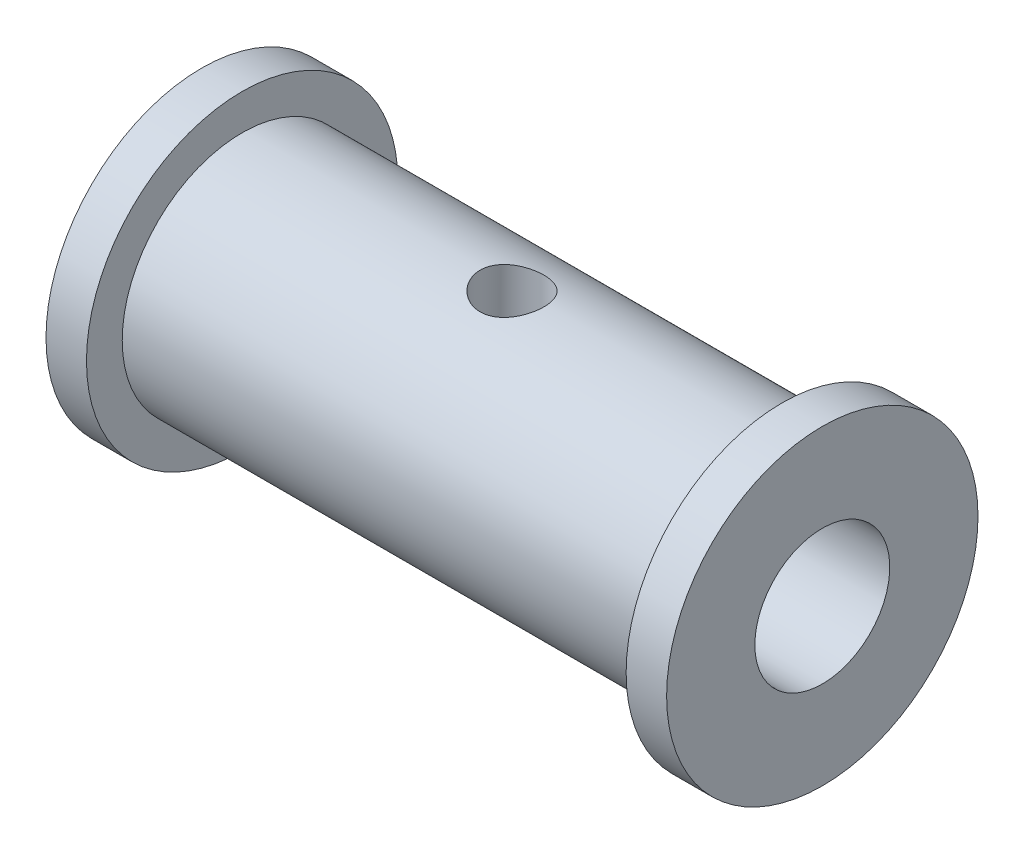
ISO-10303-21;
HEADER;
FILE_DESCRIPTION(('STEP AP214'),'2;1');
FILE_NAME('part.step','',(''),(''),'','','');
FILE_SCHEMA(('AUTOMOTIVE_DESIGN { 1 0 10303 214 1 1 1 1 }'));
ENDSEC;
DATA;
#1=APPLICATION_CONTEXT('core data for automotive mechanical design processes');
#2=APPLICATION_PROTOCOL_DEFINITION('international standard','automotive_design',2000,#1);
#3=PRODUCT_CONTEXT('',#1,'mechanical');
#4=PRODUCT('Part','Part','',(#3));
#5=PRODUCT_RELATED_PRODUCT_CATEGORY('part','',(#4));
#6=PRODUCT_DEFINITION_FORMATION('','',#4);
#7=PRODUCT_DEFINITION_CONTEXT('part definition',#1,'design');
#8=PRODUCT_DEFINITION('design','',#6,#7);
#9=PRODUCT_DEFINITION_SHAPE('','',#8);
#10=(LENGTH_UNIT() NAMED_UNIT(*) SI_UNIT(.MILLI.,.METRE.));
#11=(NAMED_UNIT(*) PLANE_ANGLE_UNIT() SI_UNIT($,.RADIAN.));
#12=(NAMED_UNIT(*) SI_UNIT($,.STERADIAN.) SOLID_ANGLE_UNIT());
#13=UNCERTAINTY_MEASURE_WITH_UNIT(LENGTH_MEASURE(1.E-05),#10,'distance_accuracy_value','');
#14=(GEOMETRIC_REPRESENTATION_CONTEXT(3) GLOBAL_UNCERTAINTY_ASSIGNED_CONTEXT((#13)) GLOBAL_UNIT_ASSIGNED_CONTEXT((#10,
#11,#12)) REPRESENTATION_CONTEXT('',''));
#15=CARTESIAN_POINT('',(0.,0.,0.));
#16=DIRECTION('',(0.,0.,1.));
#17=DIRECTION('',(1.,0.,0.));
#18=AXIS2_PLACEMENT_3D('',#15,#16,#17);
#19=CARTESIAN_POINT('',(-15.2755244755245,0.,0.));
#20=DIRECTION('',(-1.,0.,0.));
#21=DIRECTION('',(0.,0.,1.));
#22=AXIS2_PLACEMENT_3D('',#19,#20,#21);
#23=CYLINDRICAL_SURFACE('',#22,3.175);
#24=CARTESIAN_POINT('',(14.605,0.,0.));
#25=DIRECTION('',(-1.,0.,0.));
#26=DIRECTION('',(0.,0.,1.));
#27=AXIS2_PLACEMENT_3D('',#24,#25,#26);
#28=CIRCLE('',#27,3.175);
#29=CARTESIAN_POINT('',(14.605,0.,3.175));
#30=VERTEX_POINT('',#29);
#31=EDGE_CURVE('E70',#30,#30,#28,.T.);
#32=ORIENTED_EDGE('',*,*,#31,.F.);
#33=EDGE_LOOP('',(#32));
#34=FACE_BOUND('',#33,.T.);
#35=CARTESIAN_POINT('',(-14.605,0.,0.));
#36=DIRECTION('',(-1.,0.,0.));
#37=DIRECTION('',(0.,0.,1.));
#38=AXIS2_PLACEMENT_3D('',#35,#36,#37);
#39=CIRCLE('',#38,3.175);
#40=CARTESIAN_POINT('',(-14.605,0.,3.175));
#41=VERTEX_POINT('',#40);
#42=EDGE_CURVE('E64',#41,#41,#39,.T.);
#43=ORIENTED_EDGE('',*,*,#42,.T.);
#44=EDGE_LOOP('',(#43));
#45=FACE_BOUND('',#44,.T.);
#46=CARTESIAN_POINT('',(0.,2.7983253920872,-1.5));
#47=CARTESIAN_POINT('',(0.0788107476010317,2.79833097649977,-1.49999523547047));
#48=CARTESIAN_POINT('',(0.157735612205732,2.80170427159323,-1.49374832449328));
#49=CARTESIAN_POINT('',(0.313214667514685,2.81472644561665,-1.4690554061353));
#50=CARTESIAN_POINT('',(0.389762907162894,2.82438992585351,-1.45058101361493));
#51=CARTESIAN_POINT('',(0.537952673756733,2.84863009396432,-1.40237253355636));
#52=CARTESIAN_POINT('',(0.609616136431819,2.86318279906116,-1.37269332197988));
#53=CARTESIAN_POINT('',(0.74692939284759,2.89552502377023,-1.30308399064543));
#54=CARTESIAN_POINT('',(0.8125794422789,2.91331440566267,-1.26315430701281));
#55=CARTESIAN_POINT('',(0.941323245258398,2.95172227722859,-1.1707430871524));
#56=CARTESIAN_POINT('',(1.00387788849068,2.97245254188493,-1.11755658650795));
#57=CARTESIAN_POINT('',(1.11959143684936,3.01349951044786,-1.00161259672222));
#58=CARTESIAN_POINT('',(1.17274606260041,3.03381602228766,-0.938850772491945));
#59=CARTESIAN_POINT('',(1.27118937954777,3.07317288716969,-0.801034900704515));
#60=CARTESIAN_POINT('',(1.31583450125175,3.09206866660246,-0.725476017233364));
#61=CARTESIAN_POINT('',(1.39153752206176,3.12503381595021,-0.566861686619154));
#62=CARTESIAN_POINT('',(1.42260309774527,3.13910591174128,-0.483810507023549));
#63=CARTESIAN_POINT('',(1.46819431985617,3.16003750546179,-0.318263833167133));
#64=CARTESIAN_POINT('',(1.4836598006004,3.16730464125021,-0.23607983759682));
#65=CARTESIAN_POINT('',(1.50068669846295,3.17531500926786,-0.0699854874354078));
#66=CARTESIAN_POINT('',(1.50225551712034,3.17606171435844,0.0139239243031286));
#67=CARTESIAN_POINT('',(1.49185310738046,3.1711569999128,0.17410404695592));
#68=CARTESIAN_POINT('',(1.4809263684281,3.16599910390162,0.250460926307549));
#69=CARTESIAN_POINT('',(1.44768451199486,3.15058713309443,0.400106757592313));
#70=CARTESIAN_POINT('',(1.42536854800002,3.14033267949386,0.473395481043944));
#71=CARTESIAN_POINT('',(1.36978180811971,3.11549383971164,0.61616215999247));
#72=CARTESIAN_POINT('',(1.33635400002596,3.10084769916082,0.685567785451937));
#73=CARTESIAN_POINT('',(1.25968096352203,3.06858481389696,0.817962218284119));
#74=CARTESIAN_POINT('',(1.21643213988174,3.05096698193041,0.880948663490016));
#75=CARTESIAN_POINT('',(1.11701776567009,3.01265189942243,1.00453666893054));
#76=CARTESIAN_POINT('',(1.06005736803148,2.9918200943109,1.0644578414785));
#77=CARTESIAN_POINT('',(0.93699705964444,2.95046283361779,1.17424124933889));
#78=CARTESIAN_POINT('',(0.87089145595116,2.92993757775203,1.2240971710571));
#79=CARTESIAN_POINT('',(0.727172138151077,2.89039711066438,1.31484174230845));
#80=CARTESIAN_POINT('',(0.649138941996297,2.87151577260243,1.35512986365461));
#81=CARTESIAN_POINT('',(0.486283743531031,2.83914834140001,1.42170562946273));
#82=CARTESIAN_POINT('',(0.401468219875632,2.82565717160027,1.44800645544408));
#83=CARTESIAN_POINT('',(0.234253704737598,2.80697974613979,1.48387059914899));
#84=CARTESIAN_POINT('',(0.152157558069844,2.80124227464673,1.4945499135996));
#85=CARTESIAN_POINT('',(-0.0128364544628812,2.79714234532468,1.50221328025957));
#86=CARTESIAN_POINT('',(-0.0957338532268694,2.79877582206013,1.49920488189903));
#87=CARTESIAN_POINT('',(-0.25184110118071,2.80865284380239,1.4806017347564));
#88=CARTESIAN_POINT('',(-0.32523813353968,2.81627144126264,1.46619608896935));
#89=CARTESIAN_POINT('',(-0.468463633051388,2.83637948512089,1.42690562153975));
#90=CARTESIAN_POINT('',(-0.538291075738513,2.8488703210638,1.40201781025962));
#91=CARTESIAN_POINT('',(-0.676035807524976,2.87800314814948,1.3412324594274));
#92=CARTESIAN_POINT('',(-0.743715994140066,2.89481019393091,1.30487958898417));
#93=CARTESIAN_POINT('',(-0.872389828600745,2.93050507850425,1.22260967416881));
#94=CARTESIAN_POINT('',(-0.93338011780599,2.94939395301752,1.17668785898318));
#95=CARTESIAN_POINT('',(-1.05395122429284,2.98962533435876,1.07066250220429));
#96=CARTESIAN_POINT('',(-1.11263900919066,3.0110091844446,1.00955462247668));
#97=CARTESIAN_POINT('',(-1.2191662131219,3.05197816465585,0.877952835832725));
#98=CARTESIAN_POINT('',(-1.26700313884629,3.07156288076261,0.807456777596013));
#99=CARTESIAN_POINT('',(-1.35106340432696,3.10717258491727,0.657374049291596));
#100=CARTESIAN_POINT('',(-1.38708244177874,3.12313361565429,0.577656753882327));
#101=CARTESIAN_POINT('',(-1.44486593502356,3.14922093597641,0.412327293299583));
#102=CARTESIAN_POINT('',(-1.46664154231209,3.15935178938716,0.326719797872878));
#103=CARTESIAN_POINT('',(-1.49363889435459,3.17197971044583,0.159896332874223));
#104=CARTESIAN_POINT('',(-1.50011013632642,3.17505233840112,0.078925398284078));
#105=CARTESIAN_POINT('',(-1.49988711965684,3.17494636529876,-0.0829833461657175));
#106=CARTESIAN_POINT('',(-1.49319653511093,3.17176950877122,-0.163921158963004));
#107=CARTESIAN_POINT('',(-1.46770848023088,3.15985410378094,-0.318841842835547));
#108=CARTESIAN_POINT('',(-1.44959197491994,3.15142868675494,-0.392963167600614));
#109=CARTESIAN_POINT('',(-1.40262108547478,3.13010132928976,-0.537026434022491));
#110=CARTESIAN_POINT('',(-1.37376499240882,3.1171986764347,-0.60696770847403));
#111=CARTESIAN_POINT('',(-1.30473490189286,3.08738510301285,-0.744198443618439));
#112=CARTESIAN_POINT('',(-1.26410939390821,3.0703197298679,-0.811226286131094));
#113=CARTESIAN_POINT('',(-1.17328432091972,3.03405477724481,-0.937805412907553));
#114=CARTESIAN_POINT('',(-1.12308040855481,3.01485423033003,-0.997353281796323));
#115=CARTESIAN_POINT('',(-1.00928446778082,2.97425749382228,-1.11287613406119));
#116=CARTESIAN_POINT('',(-0.944896373173603,2.9528185885393,-1.16805442942683));
#117=CARTESIAN_POINT('',(-0.807312145748489,2.91171333700677,-1.26705651381277));
#118=CARTESIAN_POINT('',(-0.734109598744511,2.89204830000693,-1.31087196019013));
#119=CARTESIAN_POINT('',(-0.579232422210802,2.85663554941127,-1.3863737982034));
#120=CARTESIAN_POINT('',(-0.497439352525226,2.84095675906997,-1.41785130272302));
#121=CARTESIAN_POINT('',(-0.328811998329219,2.81635628214136,-1.4661232120466));
#122=CARTESIAN_POINT('',(-0.241995696672077,2.80741192483264,-1.48296690968124));
#123=CARTESIAN_POINT('',(-0.128694633247988,2.80116429672363,-1.49469268672873));
#124=CARTESIAN_POINT('',(-0.10301180774758,2.80010260103933,-1.49668048940514));
#125=CARTESIAN_POINT('',(-0.0515567295081782,2.79868221732461,-1.49933495903092));
#126=CARTESIAN_POINT('',(-0.0257844722890938,2.79832356503778,-1.50000155880871));
#127=CARTESIAN_POINT('',(0.,2.7983253920872,-1.5));
#128=B_SPLINE_CURVE_WITH_KNOTS('',3,(#46,#47,#48,#49,#50,#51,#52,#53,#54,#55,#56,#57,#58,#59,
#60,#61,#62,#63,#64,#65,#66,#67,#68,#69,#70,#71,#72,#73,#74,#75,#76,#77,#78,#79,#80,#81,#82,#83,
#84,#85,#86,#87,#88,#89,#90,#91,#92,#93,#94,#95,#96,#97,#98,#99,#100,#101,#102,#103,#104,#105,
#106,#107,#108,#109,#110,#111,#112,#113,#114,#115,#116,#117,#118,#119,#120,#121,#122,#123,#124,
#125,#126,#127),.UNSPECIFIED.,.T.,.F.,(4,2,2,2,2,2,2,2,2,2,2,2,2,2,2,2,2,2,2,2,2,2,2,2,2,2,2,2,
2,2,2,2,2,2,2,2,2,2,2,2,4),(0.,0.236323871838544,0.473198284289302,0.708927337380699,
0.944646362603916,1.19762429635865,1.45071710395354,1.71864285343498,1.98641694681215,
2.23687152724756,2.48719270436037,2.71802817018661,2.94888079555674,3.1831453100556,
3.41749572162706,3.67216706074964,3.92699765369087,4.19506898546716,4.46288723920479,
4.71043828617548,4.95785281342715,5.18239796950746,5.40700721193729,5.64198832122139,
5.87708686716682,6.13804637958085,6.39906579463174,6.66438519401193,6.92949661955738,
7.17207877892644,7.41459323161728,7.64386670961211,7.87317668624822,8.11282240294707,
8.35257714778319,8.61378861881715,8.87519133270404,9.14084608292566,9.40560248746477,
9.48291651801969,9.56023447921351),.UNSPECIFIED.);
#129=CARTESIAN_POINT('',(0.,2.7983253920872,-1.5));
#130=VERTEX_POINT('',#129);
#131=EDGE_CURVE('E90',#130,#130,#128,.T.);
#132=ORIENTED_EDGE('',*,*,#131,.F.);
#133=EDGE_LOOP('',(#132));
#134=FACE_BOUND('',#133,.T.);
#135=ADVANCED_FACE('F45',(#34,#45,#134),#23,.F.);
#136=CARTESIAN_POINT('',(-15.2755244755245,0.,0.));
#137=DIRECTION('',(-1.,0.,0.));
#138=DIRECTION('',(0.,0.,1.));
#139=AXIS2_PLACEMENT_3D('',#136,#137,#138);
#140=CYLINDRICAL_SURFACE('',#139,5.64515);
#141=CARTESIAN_POINT('',(-12.7,0.,0.));
#142=DIRECTION('',(-1.,0.,0.));
#143=DIRECTION('',(0.,0.,1.));
#144=AXIS2_PLACEMENT_3D('',#141,#142,#143);
#145=CIRCLE('',#144,5.64515);
#146=CARTESIAN_POINT('',(-12.7,0.,5.64515));
#147=VERTEX_POINT('',#146);
#148=EDGE_CURVE('E86',#147,#147,#145,.T.);
#149=ORIENTED_EDGE('',*,*,#148,.F.);
#150=EDGE_LOOP('',(#149));
#151=FACE_BOUND('',#150,.T.);
#152=CARTESIAN_POINT('',(12.7,0.,0.));
#153=DIRECTION('',(-1.,0.,0.));
#154=DIRECTION('',(0.,0.,1.));
#155=AXIS2_PLACEMENT_3D('',#152,#153,#154);
#156=CIRCLE('',#155,5.64515);
#157=CARTESIAN_POINT('',(12.7,0.,5.64515));
#158=VERTEX_POINT('',#157);
#159=EDGE_CURVE('E82',#158,#158,#156,.T.);
#160=ORIENTED_EDGE('',*,*,#159,.T.);
#161=EDGE_LOOP('',(#160));
#162=FACE_BOUND('',#161,.T.);
#163=CARTESIAN_POINT('',(0.,5.44221632448583,-1.5));
#164=CARTESIAN_POINT('',(0.0826436498905731,5.44221776734982,-1.49999798482397));
#165=CARTESIAN_POINT('',(0.16530868542223,5.44411939956257,-1.49314675929322));
#166=CARTESIAN_POINT('',(0.328252175478541,5.45149790283637,-1.46597434045337));
#167=CARTESIAN_POINT('',(0.40852940000449,5.45697658425119,-1.4456463264267));
#168=CARTESIAN_POINT('',(0.564316549846696,5.47084585840447,-1.39223506110244));
#169=CARTESIAN_POINT('',(0.639832974686705,5.4792323749097,-1.35916965804295));
#170=CARTESIAN_POINT('',(0.784258298044925,5.49796717883473,-1.28127804023893));
#171=CARTESIAN_POINT('',(0.853166696174541,5.50831561464326,-1.23645093580583));
#172=CARTESIAN_POINT('',(0.984131351122835,5.53009622169304,-1.13511800376794));
#173=CARTESIAN_POINT('',(1.045999199762,5.54154749766791,-1.0783727299323));
#174=CARTESIAN_POINT('',(1.15946134412678,5.56407856754538,-0.95532926139728));
#175=CARTESIAN_POINT('',(1.21105458106165,5.57515832306535,-0.889030083387623));
#176=CARTESIAN_POINT('',(1.30328774666803,5.59591104111497,-0.747455285881688));
#177=CARTESIAN_POINT('',(1.34374049853005,5.6055588379263,-0.672053715192328));
#178=CARTESIAN_POINT('',(1.41132390215023,5.62214145846994,-0.515220536696469));
#179=CARTESIAN_POINT('',(1.43845678369634,5.62907673624688,-0.433789940796049));
#180=CARTESIAN_POINT('',(1.47802084117912,5.63931781333287,-0.269176674072655));
#181=CARTESIAN_POINT('',(1.4907724800169,5.64270260418738,-0.186076025421636));
#182=CARTESIAN_POINT('',(1.50222017877792,5.64573746281875,-0.0188506571242278));
#183=CARTESIAN_POINT('',(1.50091857507756,5.6453881513968,0.0652738899743704));
#184=CARTESIAN_POINT('',(1.48452268941679,5.64105209399141,0.229928980435986));
#185=CARTESIAN_POINT('',(1.46977462197647,5.63715665623427,0.310496770097809));
#186=CARTESIAN_POINT('',(1.42746360991348,5.62627370326876,0.46797007430665));
#187=CARTESIAN_POINT('',(1.39989993721051,5.61928601238435,0.544875380506924));
#188=CARTESIAN_POINT('',(1.33247392627963,5.60286801449619,0.69372614519827));
#189=CARTESIAN_POINT('',(1.29249269629158,5.5934142425149,0.765615053879316));
#190=CARTESIAN_POINT('',(1.20145768524585,5.57308308647157,0.901781568257522));
#191=CARTESIAN_POINT('',(1.15040175929234,5.56220542679961,0.966057695813074));
#192=CARTESIAN_POINT('',(1.03682773330209,5.53981441387915,1.08724045508485));
#193=CARTESIAN_POINT('',(0.974007640829174,5.52829179055745,1.14386267184279));
#194=CARTESIAN_POINT('',(0.839644289069423,5.50620898724192,1.2458374510173));
#195=CARTESIAN_POINT('',(0.768100506093186,5.49564886509427,1.29118933637082));
#196=CARTESIAN_POINT('',(0.617707356422072,5.47664977453883,1.36955056186863));
#197=CARTESIAN_POINT('',(0.538816186462395,5.46822410361388,1.40248312266783));
#198=CARTESIAN_POINT('',(0.376337254846516,5.45461343650754,1.45452478437216));
#199=CARTESIAN_POINT('',(0.292750653817778,5.44942764329396,1.47363728528923));
#200=CARTESIAN_POINT('',(0.125912172177079,5.44305353995125,1.49700705991464));
#201=CARTESIAN_POINT('',(0.0427239810357125,5.44175115881421,1.50168837778865));
#202=CARTESIAN_POINT('',(-0.1232464577724,5.44297933834186,1.4972307826834));
#203=CARTESIAN_POINT('',(-0.206028747366463,5.44550949438728,1.48809332861816));
#204=CARTESIAN_POINT('',(-0.367207135323571,5.4540075322859,1.45663127836107));
#205=CARTESIAN_POINT('',(-0.445656740300897,5.45990903142662,1.43456112068596));
#206=CARTESIAN_POINT('',(-0.597740886982624,5.47442006116055,1.37814600803546));
#207=CARTESIAN_POINT('',(-0.671374801748043,5.48302994350498,1.34379945858488));
#208=CARTESIAN_POINT('',(-0.813512813620183,5.50222211118877,1.26294408640984));
#209=CARTESIAN_POINT('',(-0.881869725769598,5.51284337226439,1.21618598741617));
#210=CARTESIAN_POINT('',(-1.00992272855403,5.53476961780604,1.11214416757658));
#211=CARTESIAN_POINT('',(-1.06961719942342,5.54607472958491,1.05485848273389));
#212=CARTESIAN_POINT('',(-1.18040859389798,5.56848722620232,0.929427134768067));
#213=CARTESIAN_POINT('',(-1.23120994588551,5.57957964884856,0.861017194964994));
#214=CARTESIAN_POINT('',(-1.32060764860309,5.599984167669,0.716394281042795));
#215=CARTESIAN_POINT('',(-1.3592046487608,5.60929635856387,0.640181722408612));
#216=CARTESIAN_POINT('',(-1.42274469648724,5.62503122537354,0.48265320991643));
#217=CARTESIAN_POINT('',(-1.44778951135348,5.63147537138664,0.40138055252435));
#218=CARTESIAN_POINT('',(-1.48381017839642,5.64084252840109,0.235583544296043));
#219=CARTESIAN_POINT('',(-1.49478912449133,5.64376631372989,0.151059912756287));
#220=CARTESIAN_POINT('',(-1.50217372513024,5.64572704476748,-0.0160774687073766));
#221=CARTESIAN_POINT('',(-1.49901309840769,5.64487967160035,-0.0986709709983087));
#222=CARTESIAN_POINT('',(-1.4792145259925,5.63965460646783,-0.262106269548189));
#223=CARTESIAN_POINT('',(-1.46257707990777,5.63527704537237,-0.342948130629297));
#224=CARTESIAN_POINT('',(-1.41654166905826,5.62350613840027,-0.500067594383635));
#225=CARTESIAN_POINT('',(-1.38723114573617,5.61613347874035,-0.576372469362012));
#226=CARTESIAN_POINT('',(-1.31675972779932,5.59914363493961,-0.723024835745982));
#227=CARTESIAN_POINT('',(-1.27559718045501,5.58952613779831,-0.793371494524248));
#228=CARTESIAN_POINT('',(-1.18131764645405,5.56875793134443,-0.928131965195986));
#229=CARTESIAN_POINT('',(-1.12791269922945,5.5575733380131,-0.992339082223208));
#230=CARTESIAN_POINT('',(-1.01121124142991,5.53506950879546,-1.1110269742205));
#231=CARTESIAN_POINT('',(-0.947912137560949,5.52375023833045,-1.16550519116753));
#232=CARTESIAN_POINT('',(-0.811559656990754,5.50197482997724,-1.2643635861029));
#233=CARTESIAN_POINT('',(-0.738323782610976,5.49154287549226,-1.30849784931156));
#234=CARTESIAN_POINT('',(-0.585203332164704,5.47306373496142,-1.38376439419231));
#235=CARTESIAN_POINT('',(-0.505323175756261,5.46501497964844,-1.41490523720545));
#236=CARTESIAN_POINT('',(-0.354773607905721,5.45333936032317,-1.45919130067615));
#237=CARTESIAN_POINT('',(-0.284760932617647,5.44920182935005,-1.47445878618925));
#238=CARTESIAN_POINT('',(-0.143170736948714,5.44363983861492,-1.49486344059047));
#239=CARTESIAN_POINT('',(-0.0715933929966919,5.44221507454673,-1.50000174572747));
#240=CARTESIAN_POINT('',(0.,5.44221632448583,-1.5));
#241=B_SPLINE_CURVE_WITH_KNOTS('',3,(#163,#164,#165,#166,#167,#168,#169,#170,#171,#172,#173,
#174,#175,#176,#177,#178,#179,#180,#181,#182,#183,#184,#185,#186,#187,#188,#189,#190,#191,#192,
#193,#194,#195,#196,#197,#198,#199,#200,#201,#202,#203,#204,#205,#206,#207,#208,#209,#210,#211,
#212,#213,#214,#215,#216,#217,#218,#219,#220,#221,#222,#223,#224,#225,#226,#227,#228,#229,#230,
#231,#232,#233,#234,#235,#236,#237,#238,#239,#240),.UNSPECIFIED.,.T.,.F.,(4,2,2,2,2,2,2,2,2,2,2,
2,2,2,2,2,2,2,2,2,2,2,2,2,2,2,2,2,2,2,2,2,2,2,2,2,2,2,4),(0.,0.247667710125486,
0.495460862778318,0.742908051487609,0.990373963205123,1.24339169248411,1.49643548156669,
1.75350218310325,2.01052583618261,2.26170139841543,2.51283520291044,2.75768007782892,
3.00253886457703,3.24981834681255,3.49714576382274,3.75201343494891,4.00689641350378,
4.26333027004574,4.51970101723072,4.76846310534649,5.01719893228946,5.26119804243582,
5.50522885505554,5.75459010240262,6.00399791719429,6.26055652250194,6.51710147331073,
6.77169223310905,7.02622698369015,7.27300855695848,7.51978098204571,7.76487724343747,
8.010007699341,8.26163597667072,8.51333031761168,8.77050932101105,9.02751860100832,
9.24209480975804,9.45664694688028),.UNSPECIFIED.);
#242=CARTESIAN_POINT('',(0.,5.44221632448583,-1.5));
#243=VERTEX_POINT('',#242);
#244=EDGE_CURVE('E49',#243,#243,#241,.T.);
#245=ORIENTED_EDGE('',*,*,#244,.T.);
#246=EDGE_LOOP('',(#245));
#247=FACE_BOUND('',#246,.T.);
#248=ADVANCED_FACE('F105',(#151,#162,#247),#140,.T.);
#249=CARTESIAN_POINT('',(-12.7,0.,0.));
#250=DIRECTION('',(1.,0.,0.));
#251=DIRECTION('',(0.,0.,-1.));
#252=AXIS2_PLACEMENT_3D('',#249,#250,#251);
#253=PLANE('',#252);
#254=ORIENTED_EDGE('',*,*,#148,.T.);
#255=EDGE_LOOP('',(#254));
#256=FACE_BOUND('',#255,.T.);
#257=CARTESIAN_POINT('',(-12.7,0.,0.));
#258=DIRECTION('',(-1.,0.,0.));
#259=DIRECTION('',(0.,0.,1.));
#260=AXIS2_PLACEMENT_3D('',#257,#258,#259);
#261=CIRCLE('',#260,7.3279);
#262=CARTESIAN_POINT('',(-12.7,0.,7.3279));
#263=VERTEX_POINT('',#262);
#264=EDGE_CURVE('E10',#263,#263,#261,.T.);
#265=ORIENTED_EDGE('',*,*,#264,.F.);
#266=EDGE_LOOP('',(#265));
#267=FACE_BOUND('',#266,.T.);
#268=ADVANCED_FACE('F47',(#256,#267),#253,.T.);
#269=CARTESIAN_POINT('',(-15.2755244755245,0.,0.));
#270=DIRECTION('',(-1.,0.,0.));
#271=DIRECTION('',(0.,0.,1.));
#272=AXIS2_PLACEMENT_3D('',#269,#270,#271);
#273=CYLINDRICAL_SURFACE('',#272,7.3279);
#274=ORIENTED_EDGE('',*,*,#264,.T.);
#275=EDGE_LOOP('',(#274));
#276=FACE_BOUND('',#275,.T.);
#277=CARTESIAN_POINT('',(-14.605,0.,0.));
#278=DIRECTION('',(-1.,0.,0.));
#279=DIRECTION('',(0.,0.,1.));
#280=AXIS2_PLACEMENT_3D('',#277,#278,#279);
#281=CIRCLE('',#280,7.3279);
#282=CARTESIAN_POINT('',(-14.605,0.,7.3279));
#283=VERTEX_POINT('',#282);
#284=EDGE_CURVE('E59',#283,#283,#281,.T.);
#285=ORIENTED_EDGE('',*,*,#284,.F.);
#286=EDGE_LOOP('',(#285));
#287=FACE_BOUND('',#286,.T.);
#288=ADVANCED_FACE('F124',(#276,#287),#273,.T.);
#289=CARTESIAN_POINT('',(-14.605,0.,0.));
#290=DIRECTION('',(1.,0.,0.));
#291=DIRECTION('',(0.,0.,-1.));
#292=AXIS2_PLACEMENT_3D('',#289,#290,#291);
#293=PLANE('',#292);
#294=ORIENTED_EDGE('',*,*,#42,.F.);
#295=EDGE_LOOP('',(#294));
#296=FACE_BOUND('',#295,.T.);
#297=ORIENTED_EDGE('',*,*,#284,.T.);
#298=EDGE_LOOP('',(#297));
#299=FACE_BOUND('',#298,.T.);
#300=ADVANCED_FACE('F119',(#296,#299),#293,.F.);
#301=CARTESIAN_POINT('',(14.605,0.,0.));
#302=DIRECTION('',(1.,0.,0.));
#303=DIRECTION('',(0.,0.,-1.));
#304=AXIS2_PLACEMENT_3D('',#301,#302,#303);
#305=PLANE('',#304);
#306=ORIENTED_EDGE('',*,*,#31,.T.);
#307=EDGE_LOOP('',(#306));
#308=FACE_BOUND('',#307,.T.);
#309=CARTESIAN_POINT('',(14.605,0.,0.));
#310=DIRECTION('',(-1.,0.,0.));
#311=DIRECTION('',(0.,0.,1.));
#312=AXIS2_PLACEMENT_3D('',#309,#310,#311);
#313=CIRCLE('',#312,7.3279);
#314=CARTESIAN_POINT('',(14.605,0.,7.3279));
#315=VERTEX_POINT('',#314);
#316=EDGE_CURVE('E74',#315,#315,#313,.T.);
#317=ORIENTED_EDGE('',*,*,#316,.F.);
#318=EDGE_LOOP('',(#317));
#319=FACE_BOUND('',#318,.T.);
#320=ADVANCED_FACE('F116',(#308,#319),#305,.T.);
#321=CARTESIAN_POINT('',(-15.2755244755245,0.,0.));
#322=DIRECTION('',(-1.,0.,0.));
#323=DIRECTION('',(0.,0.,1.));
#324=AXIS2_PLACEMENT_3D('',#321,#322,#323);
#325=CYLINDRICAL_SURFACE('',#324,7.3279);
#326=CARTESIAN_POINT('',(12.7,0.,0.));
#327=DIRECTION('',(-1.,0.,0.));
#328=DIRECTION('',(0.,0.,1.));
#329=AXIS2_PLACEMENT_3D('',#326,#327,#328);
#330=CIRCLE('',#329,7.3279);
#331=CARTESIAN_POINT('',(12.7,0.,7.3279));
#332=VERTEX_POINT('',#331);
#333=EDGE_CURVE('E78',#332,#332,#330,.T.);
#334=ORIENTED_EDGE('',*,*,#333,.F.);
#335=EDGE_LOOP('',(#334));
#336=FACE_BOUND('',#335,.T.);
#337=ORIENTED_EDGE('',*,*,#316,.T.);
#338=EDGE_LOOP('',(#337));
#339=FACE_BOUND('',#338,.T.);
#340=ADVANCED_FACE('F113',(#336,#339),#325,.T.);
#341=CARTESIAN_POINT('',(12.7,0.,0.));
#342=DIRECTION('',(1.,0.,0.));
#343=DIRECTION('',(0.,0.,-1.));
#344=AXIS2_PLACEMENT_3D('',#341,#342,#343);
#345=PLANE('',#344);
#346=ORIENTED_EDGE('',*,*,#159,.F.);
#347=EDGE_LOOP('',(#346));
#348=FACE_BOUND('',#347,.T.);
#349=ORIENTED_EDGE('',*,*,#333,.T.);
#350=EDGE_LOOP('',(#349));
#351=FACE_BOUND('',#350,.T.);
#352=ADVANCED_FACE('F103',(#348,#351),#345,.F.);
#353=CARTESIAN_POINT('',(0.,7.3279,0.));
#354=DIRECTION('',(0.,-1.,0.));
#355=DIRECTION('',(0.,0.,-1.));
#356=AXIS2_PLACEMENT_3D('',#353,#354,#355);
#357=CYLINDRICAL_SURFACE('',#356,1.5);
#358=ORIENTED_EDGE('',*,*,#244,.F.);
#359=EDGE_LOOP('',(#358));
#360=FACE_BOUND('',#359,.T.);
#361=ORIENTED_EDGE('',*,*,#131,.T.);
#362=EDGE_LOOP('',(#361));
#363=FACE_BOUND('',#362,.T.);
#364=ADVANCED_FACE('F100',(#360,#363),#357,.F.);
#365=CLOSED_SHELL('',(#135,#248,#268,#288,#300,#320,#340,#352,#364));
#366=MANIFOLD_SOLID_BREP('B2',#365);
#367=ADVANCED_BREP_SHAPE_REPRESENTATION('',(#18,#366),#14);
#368=SHAPE_DEFINITION_REPRESENTATION(#9,#367);
ENDSEC;
END-ISO-10303-21;
